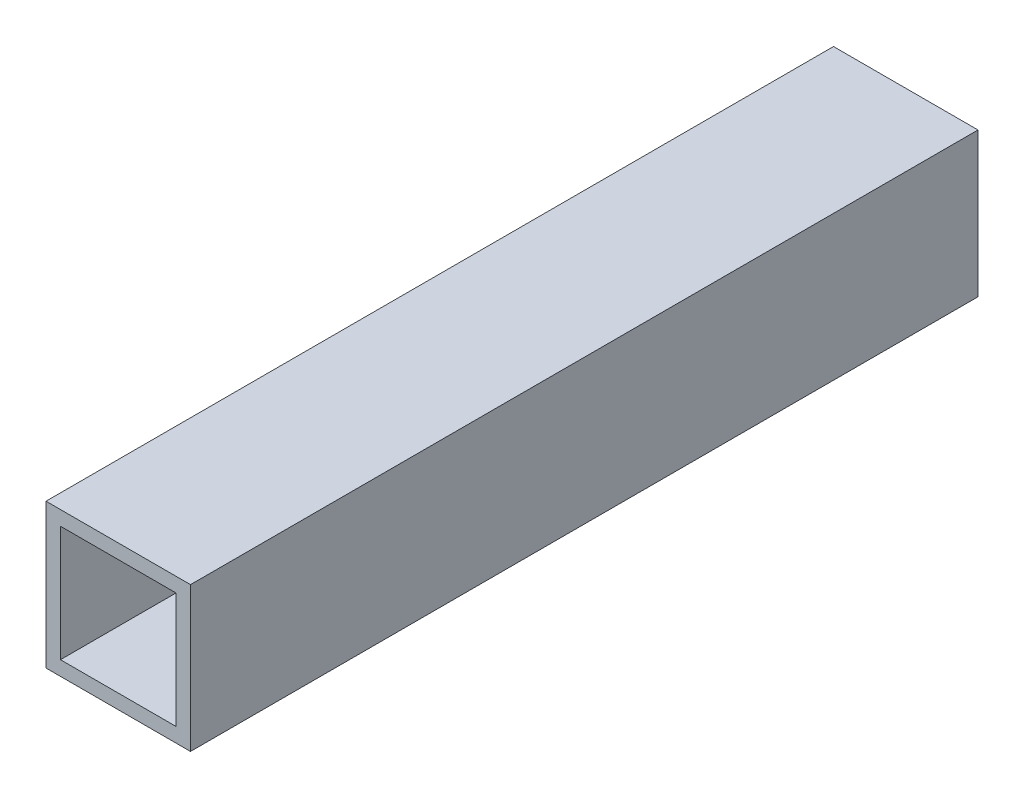
ISO-10303-21;
HEADER;
FILE_DESCRIPTION(('STEP AP214'),'2;1');
FILE_NAME('part.step','',(''),(''),'','','');
FILE_SCHEMA(('AUTOMOTIVE_DESIGN { 1 0 10303 214 1 1 1 1 }'));
ENDSEC;
DATA;
#1=APPLICATION_CONTEXT('core data for automotive mechanical design processes');
#2=APPLICATION_PROTOCOL_DEFINITION('international standard','automotive_design',2000,#1);
#3=PRODUCT_CONTEXT('',#1,'mechanical');
#4=PRODUCT('Part','Part','',(#3));
#5=PRODUCT_RELATED_PRODUCT_CATEGORY('part','',(#4));
#6=PRODUCT_DEFINITION_FORMATION('','',#4);
#7=PRODUCT_DEFINITION_CONTEXT('part definition',#1,'design');
#8=PRODUCT_DEFINITION('design','',#6,#7);
#9=PRODUCT_DEFINITION_SHAPE('','',#8);
#10=(LENGTH_UNIT() NAMED_UNIT(*) SI_UNIT(.MILLI.,.METRE.));
#11=(NAMED_UNIT(*) PLANE_ANGLE_UNIT() SI_UNIT($,.RADIAN.));
#12=(NAMED_UNIT(*) SI_UNIT($,.STERADIAN.) SOLID_ANGLE_UNIT());
#13=UNCERTAINTY_MEASURE_WITH_UNIT(LENGTH_MEASURE(1.E-05),#10,'distance_accuracy_value','');
#14=(GEOMETRIC_REPRESENTATION_CONTEXT(3) GLOBAL_UNCERTAINTY_ASSIGNED_CONTEXT((#13)) GLOBAL_UNIT_ASSIGNED_CONTEXT((#10,
#11,#12)) REPRESENTATION_CONTEXT('',''));
#15=CARTESIAN_POINT('',(0.,0.,0.));
#16=DIRECTION('',(0.,0.,1.));
#17=DIRECTION('',(1.,0.,0.));
#18=AXIS2_PLACEMENT_3D('',#15,#16,#17);
#19=CARTESIAN_POINT('',(0.,0.,218.));
#20=DIRECTION('',(0.,0.,1.));
#21=DIRECTION('',(1.,0.,0.));
#22=AXIS2_PLACEMENT_3D('',#19,#20,#21);
#23=PLANE('',#22);
#24=DIRECTION('',(0.,-1.,0.));
#25=VECTOR('',#24,1.);
#26=CARTESIAN_POINT('',(0.,0.,218.));
#27=LINE('',#26,#25);
#28=CARTESIAN_POINT('',(0.,40.,218.));
#29=VERTEX_POINT('',#28);
#30=CARTESIAN_POINT('',(0.,0.,218.));
#31=VERTEX_POINT('',#30);
#32=EDGE_CURVE('E159',#29,#31,#27,.T.);
#33=ORIENTED_EDGE('',*,*,#32,.T.);
#34=DIRECTION('',(1.,0.,0.));
#35=VECTOR('',#34,1.);
#36=CARTESIAN_POINT('',(0.,0.,218.));
#37=LINE('',#36,#35);
#38=CARTESIAN_POINT('',(40.,0.,218.));
#39=VERTEX_POINT('',#38);
#40=EDGE_CURVE('E162',#31,#39,#37,.T.);
#41=ORIENTED_EDGE('',*,*,#40,.T.);
#42=DIRECTION('',(0.,1.,0.));
#43=VECTOR('',#42,1.);
#44=CARTESIAN_POINT('',(40.,0.,218.));
#45=LINE('',#44,#43);
#46=CARTESIAN_POINT('',(40.,40.,218.));
#47=VERTEX_POINT('',#46);
#48=EDGE_CURVE('E165',#39,#47,#45,.T.);
#49=ORIENTED_EDGE('',*,*,#48,.T.);
#50=DIRECTION('',(-1.,0.,0.));
#51=VECTOR('',#50,1.);
#52=CARTESIAN_POINT('',(0.,40.,218.));
#53=LINE('',#52,#51);
#54=EDGE_CURVE('E167',#47,#29,#53,.T.);
#55=ORIENTED_EDGE('',*,*,#54,.T.);
#56=EDGE_LOOP('',(#33,#41,#49,#55));
#57=FACE_BOUND('',#56,.T.);
#58=DIRECTION('',(1.,0.,0.));
#59=VECTOR('',#58,1.);
#60=CARTESIAN_POINT('',(0.,4.,218.));
#61=LINE('',#60,#59);
#62=CARTESIAN_POINT('',(4.,4.,218.));
#63=VERTEX_POINT('',#62);
#64=CARTESIAN_POINT('',(36.,4.,218.));
#65=VERTEX_POINT('',#64);
#66=EDGE_CURVE('E131',#63,#65,#61,.T.);
#67=ORIENTED_EDGE('',*,*,#66,.F.);
#68=DIRECTION('',(0.,-1.,0.));
#69=VECTOR('',#68,1.);
#70=CARTESIAN_POINT('',(4.,40.,218.));
#71=LINE('',#70,#69);
#72=CARTESIAN_POINT('',(4.,36.,218.));
#73=VERTEX_POINT('',#72);
#74=EDGE_CURVE('E123',#73,#63,#71,.T.);
#75=ORIENTED_EDGE('',*,*,#74,.F.);
#76=DIRECTION('',(-1.,0.,0.));
#77=VECTOR('',#76,1.);
#78=CARTESIAN_POINT('',(0.,36.,218.));
#79=LINE('',#78,#77);
#80=CARTESIAN_POINT('',(36.,36.,218.));
#81=VERTEX_POINT('',#80);
#82=EDGE_CURVE('E145',#81,#73,#79,.T.);
#83=ORIENTED_EDGE('',*,*,#82,.F.);
#84=DIRECTION('',(0.,1.,0.));
#85=VECTOR('',#84,1.);
#86=CARTESIAN_POINT('',(36.,40.,218.));
#87=LINE('',#86,#85);
#88=EDGE_CURVE('E143',#65,#81,#87,.T.);
#89=ORIENTED_EDGE('',*,*,#88,.F.);
#90=EDGE_LOOP('',(#67,#75,#83,#89));
#91=FACE_BOUND('',#90,.T.);
#92=ADVANCED_FACE('F58',(#57,#91),#23,.T.);
#93=CARTESIAN_POINT('',(0.,0.,0.));
#94=DIRECTION('',(0.,0.,1.));
#95=DIRECTION('',(1.,0.,0.));
#96=AXIS2_PLACEMENT_3D('',#93,#94,#95);
#97=PLANE('',#96);
#98=DIRECTION('',(0.,-1.,0.));
#99=VECTOR('',#98,1.);
#100=CARTESIAN_POINT('',(0.,0.,0.));
#101=LINE('',#100,#99);
#102=CARTESIAN_POINT('',(0.,40.,0.));
#103=VERTEX_POINT('',#102);
#104=CARTESIAN_POINT('',(0.,0.,0.));
#105=VERTEX_POINT('',#104);
#106=EDGE_CURVE('E139',#103,#105,#101,.T.);
#107=ORIENTED_EDGE('',*,*,#106,.F.);
#108=DIRECTION('',(-1.,0.,0.));
#109=VECTOR('',#108,1.);
#110=CARTESIAN_POINT('',(0.,40.,0.));
#111=LINE('',#110,#109);
#112=CARTESIAN_POINT('',(40.,40.,0.));
#113=VERTEX_POINT('',#112);
#114=EDGE_CURVE('E163',#113,#103,#111,.T.);
#115=ORIENTED_EDGE('',*,*,#114,.F.);
#116=DIRECTION('',(0.,1.,0.));
#117=VECTOR('',#116,1.);
#118=CARTESIAN_POINT('',(40.,0.,0.));
#119=LINE('',#118,#117);
#120=CARTESIAN_POINT('',(40.,0.,0.));
#121=VERTEX_POINT('',#120);
#122=EDGE_CURVE('E174',#121,#113,#119,.T.);
#123=ORIENTED_EDGE('',*,*,#122,.F.);
#124=DIRECTION('',(1.,0.,0.));
#125=VECTOR('',#124,1.);
#126=CARTESIAN_POINT('',(0.,0.,0.));
#127=LINE('',#126,#125);
#128=EDGE_CURVE('E172',#105,#121,#127,.T.);
#129=ORIENTED_EDGE('',*,*,#128,.F.);
#130=EDGE_LOOP('',(#107,#115,#123,#129));
#131=FACE_BOUND('',#130,.T.);
#132=DIRECTION('',(0.,-1.,0.));
#133=VECTOR('',#132,1.);
#134=CARTESIAN_POINT('',(4.,40.,0.));
#135=LINE('',#134,#133);
#136=CARTESIAN_POINT('',(4.,36.,0.));
#137=VERTEX_POINT('',#136);
#138=CARTESIAN_POINT('',(4.,4.,0.));
#139=VERTEX_POINT('',#138);
#140=EDGE_CURVE('E81',#137,#139,#135,.T.);
#141=ORIENTED_EDGE('',*,*,#140,.T.);
#142=DIRECTION('',(1.,0.,0.));
#143=VECTOR('',#142,1.);
#144=CARTESIAN_POINT('',(0.,4.,0.));
#145=LINE('',#144,#143);
#146=CARTESIAN_POINT('',(36.,4.,0.));
#147=VERTEX_POINT('',#146);
#148=EDGE_CURVE('E138',#139,#147,#145,.T.);
#149=ORIENTED_EDGE('',*,*,#148,.T.);
#150=DIRECTION('',(0.,1.,0.));
#151=VECTOR('',#150,1.);
#152=CARTESIAN_POINT('',(36.,40.,0.));
#153=LINE('',#152,#151);
#154=CARTESIAN_POINT('',(36.,36.,0.));
#155=VERTEX_POINT('',#154);
#156=EDGE_CURVE('E151',#147,#155,#153,.T.);
#157=ORIENTED_EDGE('',*,*,#156,.T.);
#158=DIRECTION('',(-1.,0.,0.));
#159=VECTOR('',#158,1.);
#160=CARTESIAN_POINT('',(0.,36.,0.));
#161=LINE('',#160,#159);
#162=EDGE_CURVE('E132',#155,#137,#161,.T.);
#163=ORIENTED_EDGE('',*,*,#162,.T.);
#164=EDGE_LOOP('',(#141,#149,#157,#163));
#165=FACE_BOUND('',#164,.T.);
#166=ADVANCED_FACE('F192',(#131,#165),#97,.F.);
#167=CARTESIAN_POINT('',(0.,0.,218.));
#168=DIRECTION('',(1.,0.,0.));
#169=DIRECTION('',(0.,0.,-1.));
#170=AXIS2_PLACEMENT_3D('',#167,#168,#169);
#171=PLANE('',#170);
#172=ORIENTED_EDGE('',*,*,#106,.T.);
#173=DIRECTION('',(0.,0.,-1.));
#174=VECTOR('',#173,1.);
#175=CARTESIAN_POINT('',(0.,0.,218.));
#176=LINE('',#175,#174);
#177=EDGE_CURVE('E12',#31,#105,#176,.T.);
#178=ORIENTED_EDGE('',*,*,#177,.F.);
#179=ORIENTED_EDGE('',*,*,#32,.F.);
#180=DIRECTION('',(0.,0.,-1.));
#181=VECTOR('',#180,1.);
#182=CARTESIAN_POINT('',(0.,40.,218.));
#183=LINE('',#182,#181);
#184=EDGE_CURVE('E169',#29,#103,#183,.T.);
#185=ORIENTED_EDGE('',*,*,#184,.T.);
#186=EDGE_LOOP('',(#172,#178,#179,#185));
#187=FACE_BOUND('',#186,.T.);
#188=ADVANCED_FACE('F60',(#187),#171,.F.);
#189=CARTESIAN_POINT('',(0.,0.,218.));
#190=DIRECTION('',(0.,1.,0.));
#191=DIRECTION('',(0.,0.,1.));
#192=AXIS2_PLACEMENT_3D('',#189,#190,#191);
#193=PLANE('',#192);
#194=ORIENTED_EDGE('',*,*,#128,.T.);
#195=DIRECTION('',(0.,0.,-1.));
#196=VECTOR('',#195,1.);
#197=CARTESIAN_POINT('',(40.,0.,218.));
#198=LINE('',#197,#196);
#199=EDGE_CURVE('E66',#39,#121,#198,.T.);
#200=ORIENTED_EDGE('',*,*,#199,.F.);
#201=ORIENTED_EDGE('',*,*,#40,.F.);
#202=ORIENTED_EDGE('',*,*,#177,.T.);
#203=EDGE_LOOP('',(#194,#200,#201,#202));
#204=FACE_BOUND('',#203,.T.);
#205=ADVANCED_FACE('F202',(#204),#193,.F.);
#206=CARTESIAN_POINT('',(40.,0.,218.));
#207=DIRECTION('',(-1.,0.,0.));
#208=DIRECTION('',(0.,0.,1.));
#209=AXIS2_PLACEMENT_3D('',#206,#207,#208);
#210=PLANE('',#209);
#211=ORIENTED_EDGE('',*,*,#122,.T.);
#212=DIRECTION('',(0.,0.,-1.));
#213=VECTOR('',#212,1.);
#214=CARTESIAN_POINT('',(40.,40.,218.));
#215=LINE('',#214,#213);
#216=EDGE_CURVE('E179',#47,#113,#215,.T.);
#217=ORIENTED_EDGE('',*,*,#216,.F.);
#218=ORIENTED_EDGE('',*,*,#48,.F.);
#219=ORIENTED_EDGE('',*,*,#199,.T.);
#220=EDGE_LOOP('',(#211,#217,#218,#219));
#221=FACE_BOUND('',#220,.T.);
#222=ADVANCED_FACE('F186',(#221),#210,.F.);
#223=CARTESIAN_POINT('',(0.,40.,218.));
#224=DIRECTION('',(0.,-1.,0.));
#225=DIRECTION('',(0.,0.,-1.));
#226=AXIS2_PLACEMENT_3D('',#223,#224,#225);
#227=PLANE('',#226);
#228=ORIENTED_EDGE('',*,*,#114,.T.);
#229=ORIENTED_EDGE('',*,*,#184,.F.);
#230=ORIENTED_EDGE('',*,*,#54,.F.);
#231=ORIENTED_EDGE('',*,*,#216,.T.);
#232=EDGE_LOOP('',(#228,#229,#230,#231));
#233=FACE_BOUND('',#232,.T.);
#234=ADVANCED_FACE('F196',(#233),#227,.F.);
#235=CARTESIAN_POINT('',(4.,40.,218.));
#236=DIRECTION('',(1.,0.,0.));
#237=DIRECTION('',(0.,0.,-1.));
#238=AXIS2_PLACEMENT_3D('',#235,#236,#237);
#239=PLANE('',#238);
#240=ORIENTED_EDGE('',*,*,#140,.F.);
#241=DIRECTION('',(0.,0.,-1.));
#242=VECTOR('',#241,1.);
#243=CARTESIAN_POINT('',(4.,36.,218.));
#244=LINE('',#243,#242);
#245=EDGE_CURVE('E127',#73,#137,#244,.T.);
#246=ORIENTED_EDGE('',*,*,#245,.F.);
#247=ORIENTED_EDGE('',*,*,#74,.T.);
#248=DIRECTION('',(0.,0.,-1.));
#249=VECTOR('',#248,1.);
#250=CARTESIAN_POINT('',(4.,4.,218.));
#251=LINE('',#250,#249);
#252=EDGE_CURVE('E126',#63,#139,#251,.T.);
#253=ORIENTED_EDGE('',*,*,#252,.T.);
#254=EDGE_LOOP('',(#240,#246,#247,#253));
#255=FACE_BOUND('',#254,.T.);
#256=ADVANCED_FACE('F125',(#255),#239,.T.);
#257=CARTESIAN_POINT('',(0.,4.,218.));
#258=DIRECTION('',(0.,1.,0.));
#259=DIRECTION('',(0.,0.,1.));
#260=AXIS2_PLACEMENT_3D('',#257,#258,#259);
#261=PLANE('',#260);
#262=ORIENTED_EDGE('',*,*,#148,.F.);
#263=ORIENTED_EDGE('',*,*,#252,.F.);
#264=ORIENTED_EDGE('',*,*,#66,.T.);
#265=DIRECTION('',(0.,0.,-1.));
#266=VECTOR('',#265,1.);
#267=CARTESIAN_POINT('',(36.,4.,218.));
#268=LINE('',#267,#266);
#269=EDGE_CURVE('E140',#65,#147,#268,.T.);
#270=ORIENTED_EDGE('',*,*,#269,.T.);
#271=EDGE_LOOP('',(#262,#263,#264,#270));
#272=FACE_BOUND('',#271,.T.);
#273=ADVANCED_FACE('F135',(#272),#261,.T.);
#274=CARTESIAN_POINT('',(36.,40.,218.));
#275=DIRECTION('',(-1.,0.,0.));
#276=DIRECTION('',(0.,0.,1.));
#277=AXIS2_PLACEMENT_3D('',#274,#275,#276);
#278=PLANE('',#277);
#279=ORIENTED_EDGE('',*,*,#156,.F.);
#280=ORIENTED_EDGE('',*,*,#269,.F.);
#281=ORIENTED_EDGE('',*,*,#88,.T.);
#282=DIRECTION('',(0.,0.,-1.));
#283=VECTOR('',#282,1.);
#284=CARTESIAN_POINT('',(36.,36.,218.));
#285=LINE('',#284,#283);
#286=EDGE_CURVE('E73',#81,#155,#285,.T.);
#287=ORIENTED_EDGE('',*,*,#286,.T.);
#288=EDGE_LOOP('',(#279,#280,#281,#287));
#289=FACE_BOUND('',#288,.T.);
#290=ADVANCED_FACE('F225',(#289),#278,.T.);
#291=CARTESIAN_POINT('',(0.,36.,218.));
#292=DIRECTION('',(0.,-1.,0.));
#293=DIRECTION('',(0.,0.,-1.));
#294=AXIS2_PLACEMENT_3D('',#291,#292,#293);
#295=PLANE('',#294);
#296=ORIENTED_EDGE('',*,*,#162,.F.);
#297=ORIENTED_EDGE('',*,*,#286,.F.);
#298=ORIENTED_EDGE('',*,*,#82,.T.);
#299=ORIENTED_EDGE('',*,*,#245,.T.);
#300=EDGE_LOOP('',(#296,#297,#298,#299));
#301=FACE_BOUND('',#300,.T.);
#302=ADVANCED_FACE('F229',(#301),#295,.T.);
#303=CLOSED_SHELL('',(#92,#166,#188,#205,#222,#234,#256,#273,#290,#302));
#304=MANIFOLD_SOLID_BREP('B2',#303);
#305=ADVANCED_BREP_SHAPE_REPRESENTATION('',(#18,#304),#14);
#306=SHAPE_DEFINITION_REPRESENTATION(#9,#305);
ENDSEC;
END-ISO-10303-21;
